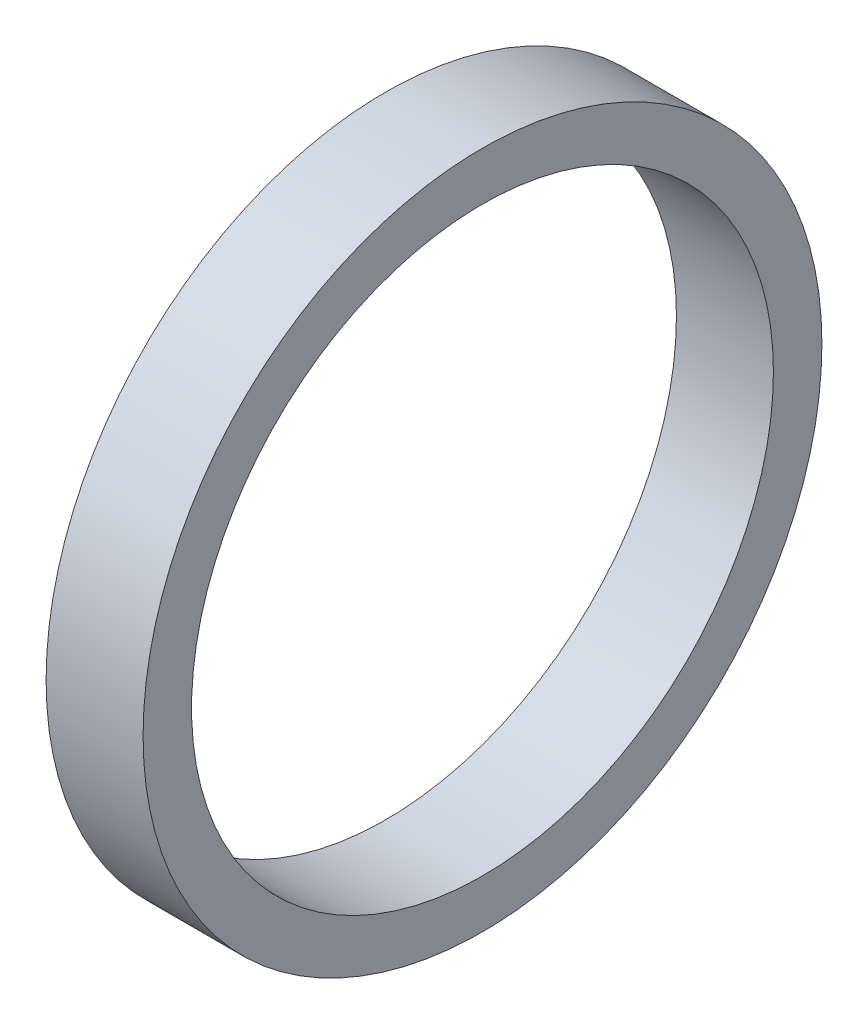
ISO-10303-21;
HEADER;
FILE_DESCRIPTION(('STEP AP214'),'2;1');
FILE_NAME('part.step','',(''),(''),'','','');
FILE_SCHEMA(('AUTOMOTIVE_DESIGN { 1 0 10303 214 1 1 1 1 }'));
ENDSEC;
DATA;
#1=APPLICATION_CONTEXT('core data for automotive mechanical design processes');
#2=APPLICATION_PROTOCOL_DEFINITION('international standard','automotive_design',2000,#1);
#3=PRODUCT_CONTEXT('',#1,'mechanical');
#4=PRODUCT('Part','Part','',(#3));
#5=PRODUCT_RELATED_PRODUCT_CATEGORY('part','',(#4));
#6=PRODUCT_DEFINITION_FORMATION('','',#4);
#7=PRODUCT_DEFINITION_CONTEXT('part definition',#1,'design');
#8=PRODUCT_DEFINITION('design','',#6,#7);
#9=PRODUCT_DEFINITION_SHAPE('','',#8);
#10=(LENGTH_UNIT() NAMED_UNIT(*) SI_UNIT(.MILLI.,.METRE.));
#11=(NAMED_UNIT(*) PLANE_ANGLE_UNIT() SI_UNIT($,.RADIAN.));
#12=(NAMED_UNIT(*) SI_UNIT($,.STERADIAN.) SOLID_ANGLE_UNIT());
#13=UNCERTAINTY_MEASURE_WITH_UNIT(LENGTH_MEASURE(1.E-05),#10,'distance_accuracy_value','');
#14=(GEOMETRIC_REPRESENTATION_CONTEXT(3) GLOBAL_UNCERTAINTY_ASSIGNED_CONTEXT((#13)) GLOBAL_UNIT_ASSIGNED_CONTEXT((#10,
#11,#12)) REPRESENTATION_CONTEXT('',''));
#15=CARTESIAN_POINT('',(0.,0.,0.));
#16=DIRECTION('',(0.,0.,1.));
#17=DIRECTION('',(1.,0.,0.));
#18=AXIS2_PLACEMENT_3D('',#15,#16,#17);
#19=CARTESIAN_POINT('',(2.,0.,0.));
#20=DIRECTION('',(1.,0.,0.));
#21=DIRECTION('',(0.,0.,-1.));
#22=AXIS2_PLACEMENT_3D('',#19,#20,#21);
#23=PLANE('',#22);
#24=CARTESIAN_POINT('',(2.,0.,0.));
#25=DIRECTION('',(1.,0.,0.));
#26=DIRECTION('',(0.,0.,-1.));
#27=AXIS2_PLACEMENT_3D('',#24,#25,#26);
#28=CIRCLE('',#27,7.);
#29=CARTESIAN_POINT('',(2.,0.,-7.));
#30=VERTEX_POINT('',#29);
#31=EDGE_CURVE('E10',#30,#30,#28,.T.);
#32=ORIENTED_EDGE('',*,*,#31,.T.);
#33=EDGE_LOOP('',(#32));
#34=FACE_BOUND('',#33,.T.);
#35=CARTESIAN_POINT('',(2.,0.,0.));
#36=DIRECTION('',(1.,0.,0.));
#37=DIRECTION('',(0.,0.,-1.));
#38=AXIS2_PLACEMENT_3D('',#35,#36,#37);
#39=CIRCLE('',#38,6.);
#40=CARTESIAN_POINT('',(2.,0.,-6.));
#41=VERTEX_POINT('',#40);
#42=EDGE_CURVE('E42',#41,#41,#39,.T.);
#43=ORIENTED_EDGE('',*,*,#42,.F.);
#44=EDGE_LOOP('',(#43));
#45=FACE_BOUND('',#44,.T.);
#46=ADVANCED_FACE('F31',(#34,#45),#23,.T.);
#47=CARTESIAN_POINT('',(0.,0.,0.));
#48=DIRECTION('',(1.,0.,0.));
#49=DIRECTION('',(0.,0.,-1.));
#50=AXIS2_PLACEMENT_3D('',#47,#48,#49);
#51=PLANE('',#50);
#52=CARTESIAN_POINT('',(0.,0.,0.));
#53=DIRECTION('',(1.,0.,0.));
#54=DIRECTION('',(0.,0.,-1.));
#55=AXIS2_PLACEMENT_3D('',#52,#53,#54);
#56=CIRCLE('',#55,7.);
#57=CARTESIAN_POINT('',(0.,0.,-7.));
#58=VERTEX_POINT('',#57);
#59=EDGE_CURVE('E35',#58,#58,#56,.T.);
#60=ORIENTED_EDGE('',*,*,#59,.F.);
#61=EDGE_LOOP('',(#60));
#62=FACE_BOUND('',#61,.T.);
#63=CARTESIAN_POINT('',(0.,0.,0.));
#64=DIRECTION('',(1.,0.,0.));
#65=DIRECTION('',(0.,0.,-1.));
#66=AXIS2_PLACEMENT_3D('',#63,#64,#65);
#67=CIRCLE('',#66,6.);
#68=CARTESIAN_POINT('',(0.,0.,-6.));
#69=VERTEX_POINT('',#68);
#70=EDGE_CURVE('E44',#69,#69,#67,.T.);
#71=ORIENTED_EDGE('',*,*,#70,.T.);
#72=EDGE_LOOP('',(#71));
#73=FACE_BOUND('',#72,.T.);
#74=ADVANCED_FACE('F54',(#62,#73),#51,.F.);
#75=CARTESIAN_POINT('',(2.,0.,0.));
#76=DIRECTION('',(-1.,0.,0.));
#77=DIRECTION('',(0.,0.,1.));
#78=AXIS2_PLACEMENT_3D('',#75,#76,#77);
#79=CYLINDRICAL_SURFACE('',#78,7.);
#80=ORIENTED_EDGE('',*,*,#31,.F.);
#81=EDGE_LOOP('',(#80));
#82=FACE_BOUND('',#81,.T.);
#83=ORIENTED_EDGE('',*,*,#59,.T.);
#84=EDGE_LOOP('',(#83));
#85=FACE_BOUND('',#84,.T.);
#86=ADVANCED_FACE('F33',(#82,#85),#79,.T.);
#87=CARTESIAN_POINT('',(2.,0.,0.));
#88=DIRECTION('',(-1.,0.,0.));
#89=DIRECTION('',(0.,0.,1.));
#90=AXIS2_PLACEMENT_3D('',#87,#88,#89);
#91=CYLINDRICAL_SURFACE('',#90,6.);
#92=ORIENTED_EDGE('',*,*,#42,.T.);
#93=EDGE_LOOP('',(#92));
#94=FACE_BOUND('',#93,.T.);
#95=ORIENTED_EDGE('',*,*,#70,.F.);
#96=EDGE_LOOP('',(#95));
#97=FACE_BOUND('',#96,.T.);
#98=ADVANCED_FACE('F50',(#94,#97),#91,.F.);
#99=CLOSED_SHELL('',(#46,#74,#86,#98));
#100=MANIFOLD_SOLID_BREP('B2',#99);
#101=ADVANCED_BREP_SHAPE_REPRESENTATION('',(#18,#100),#14);
#102=SHAPE_DEFINITION_REPRESENTATION(#9,#101);
ENDSEC;
END-ISO-10303-21;
